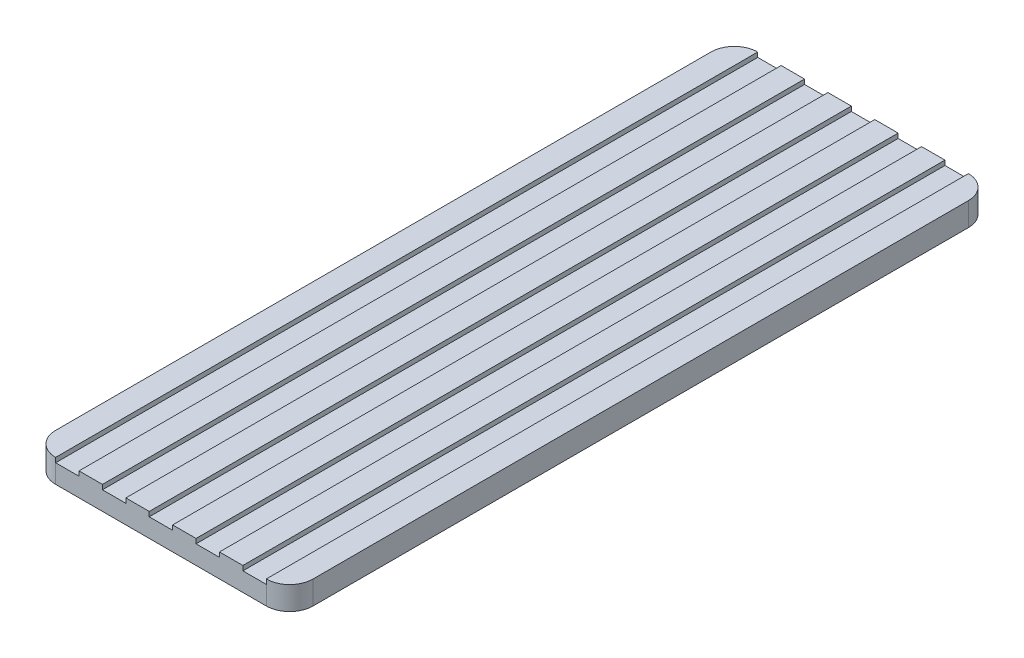
ISO-10303-21;
HEADER;
FILE_DESCRIPTION(('STEP AP214'),'2;1');
FILE_NAME('part.step','',(''),(''),'','','');
FILE_SCHEMA(('AUTOMOTIVE_DESIGN { 1 0 10303 214 1 1 1 1 }'));
ENDSEC;
DATA;
#1=APPLICATION_CONTEXT('core data for automotive mechanical design processes');
#2=APPLICATION_PROTOCOL_DEFINITION('international standard','automotive_design',2000,#1);
#3=PRODUCT_CONTEXT('',#1,'mechanical');
#4=PRODUCT('Part','Part','',(#3));
#5=PRODUCT_RELATED_PRODUCT_CATEGORY('part','',(#4));
#6=PRODUCT_DEFINITION_FORMATION('','',#4);
#7=PRODUCT_DEFINITION_CONTEXT('part definition',#1,'design');
#8=PRODUCT_DEFINITION('design','',#6,#7);
#9=PRODUCT_DEFINITION_SHAPE('','',#8);
#10=(LENGTH_UNIT() NAMED_UNIT(*) SI_UNIT(.MILLI.,.METRE.));
#11=(NAMED_UNIT(*) PLANE_ANGLE_UNIT() SI_UNIT($,.RADIAN.));
#12=(NAMED_UNIT(*) SI_UNIT($,.STERADIAN.) SOLID_ANGLE_UNIT());
#13=UNCERTAINTY_MEASURE_WITH_UNIT(LENGTH_MEASURE(1.E-05),#10,'distance_accuracy_value','');
#14=(GEOMETRIC_REPRESENTATION_CONTEXT(3) GLOBAL_UNCERTAINTY_ASSIGNED_CONTEXT((#13)) GLOBAL_UNIT_ASSIGNED_CONTEXT((#10,
#11,#12)) REPRESENTATION_CONTEXT('',''));
#15=CARTESIAN_POINT('',(0.,0.,0.));
#16=DIRECTION('',(0.,0.,1.));
#17=DIRECTION('',(1.,0.,0.));
#18=AXIS2_PLACEMENT_3D('',#15,#16,#17);
#19=CARTESIAN_POINT('',(0.,5.,0.));
#20=DIRECTION('',(0.,-1.,0.));
#21=DIRECTION('',(0.,0.,-1.));
#22=AXIS2_PLACEMENT_3D('',#19,#20,#21);
#23=PLANE('',#22);
#24=DIRECTION('',(1.,0.,0.));
#25=VECTOR('',#24,1.);
#26=CARTESIAN_POINT('',(-27.5,5.,75.));
#27=LINE('',#26,#25);
#28=CARTESIAN_POINT('',(-17.5,5.,75.));
#29=VERTEX_POINT('',#28);
#30=CARTESIAN_POINT('',(-12.5,5.,75.));
#31=VERTEX_POINT('',#30);
#32=EDGE_CURVE('E354',#29,#31,#27,.T.);
#33=ORIENTED_EDGE('',*,*,#32,.T.);
#34=DIRECTION('',(0.,0.,1.));
#35=VECTOR('',#34,1.);
#36=CARTESIAN_POINT('',(-12.5,5.,-75.));
#37=LINE('',#36,#35);
#38=CARTESIAN_POINT('',(-12.5,5.,-75.));
#39=VERTEX_POINT('',#38);
#40=EDGE_CURVE('E244',#39,#31,#37,.T.);
#41=ORIENTED_EDGE('',*,*,#40,.F.);
#42=DIRECTION('',(-1.,0.,0.));
#43=VECTOR('',#42,1.);
#44=CARTESIAN_POINT('',(-27.5,5.,-75.));
#45=LINE('',#44,#43);
#46=CARTESIAN_POINT('',(-17.5,5.,-75.));
#47=VERTEX_POINT('',#46);
#48=EDGE_CURVE('E234',#39,#47,#45,.T.);
#49=ORIENTED_EDGE('',*,*,#48,.T.);
#50=DIRECTION('',(0.,0.,1.));
#51=VECTOR('',#50,1.);
#52=CARTESIAN_POINT('',(-17.5,5.,-75.));
#53=LINE('',#52,#51);
#54=EDGE_CURVE('E337',#47,#29,#53,.T.);
#55=ORIENTED_EDGE('',*,*,#54,.T.);
#56=EDGE_LOOP('',(#33,#41,#49,#55));
#57=FACE_BOUND('',#56,.T.);
#58=ADVANCED_FACE('F39',(#57),#23,.F.);
#59=CARTESIAN_POINT('',(-2.5,5.,-75.));
#60=VERTEX_POINT('',#59);
#61=CARTESIAN_POINT('',(-7.5,5.,-75.));
#62=VERTEX_POINT('',#61);
#63=EDGE_CURVE('E348',#60,#62,#45,.T.);
#64=ORIENTED_EDGE('',*,*,#63,.T.);
#65=DIRECTION('',(0.,0.,1.));
#66=VECTOR('',#65,1.);
#67=CARTESIAN_POINT('',(-7.5,5.,-75.));
#68=LINE('',#67,#66);
#69=CARTESIAN_POINT('',(-7.5,5.,75.));
#70=VERTEX_POINT('',#69);
#71=EDGE_CURVE('E247',#62,#70,#68,.T.);
#72=ORIENTED_EDGE('',*,*,#71,.T.);
#73=CARTESIAN_POINT('',(-2.5,5.,75.));
#74=VERTEX_POINT('',#73);
#75=EDGE_CURVE('E358',#70,#74,#27,.T.);
#76=ORIENTED_EDGE('',*,*,#75,.T.);
#77=DIRECTION('',(0.,0.,1.));
#78=VECTOR('',#77,1.);
#79=CARTESIAN_POINT('',(-2.5,5.,-75.));
#80=LINE('',#79,#78);
#81=EDGE_CURVE('E242',#60,#74,#80,.T.);
#82=ORIENTED_EDGE('',*,*,#81,.F.);
#83=EDGE_LOOP('',(#64,#72,#76,#82));
#84=FACE_BOUND('',#83,.T.);
#85=ADVANCED_FACE('F471',(#84),#23,.F.);
#86=CARTESIAN_POINT('',(7.5,5.,-75.));
#87=VERTEX_POINT('',#86);
#88=CARTESIAN_POINT('',(2.5,5.,-75.));
#89=VERTEX_POINT('',#88);
#90=EDGE_CURVE('E507',#87,#89,#45,.T.);
#91=ORIENTED_EDGE('',*,*,#90,.T.);
#92=DIRECTION('',(0.,0.,1.));
#93=VECTOR('',#92,1.);
#94=CARTESIAN_POINT('',(2.5,5.,-75.));
#95=LINE('',#94,#93);
#96=CARTESIAN_POINT('',(2.5,5.,75.));
#97=VERTEX_POINT('',#96);
#98=EDGE_CURVE('E270',#89,#97,#95,.T.);
#99=ORIENTED_EDGE('',*,*,#98,.T.);
#100=CARTESIAN_POINT('',(7.5,5.,75.));
#101=VERTEX_POINT('',#100);
#102=EDGE_CURVE('E521',#97,#101,#27,.T.);
#103=ORIENTED_EDGE('',*,*,#102,.T.);
#104=DIRECTION('',(0.,0.,1.));
#105=VECTOR('',#104,1.);
#106=CARTESIAN_POINT('',(7.5,5.,-75.));
#107=LINE('',#106,#105);
#108=EDGE_CURVE('E265',#87,#101,#107,.T.);
#109=ORIENTED_EDGE('',*,*,#108,.F.);
#110=EDGE_LOOP('',(#91,#99,#103,#109));
#111=FACE_BOUND('',#110,.T.);
#112=ADVANCED_FACE('F478',(#111),#23,.F.);
#113=CARTESIAN_POINT('',(17.5,5.,-75.));
#114=VERTEX_POINT('',#113);
#115=CARTESIAN_POINT('',(12.5,5.,-75.));
#116=VERTEX_POINT('',#115);
#117=EDGE_CURVE('E349',#114,#116,#45,.T.);
#118=ORIENTED_EDGE('',*,*,#117,.T.);
#119=DIRECTION('',(0.,0.,1.));
#120=VECTOR('',#119,1.);
#121=CARTESIAN_POINT('',(12.5,5.,-75.));
#122=LINE('',#121,#120);
#123=CARTESIAN_POINT('',(12.5,5.,75.));
#124=VERTEX_POINT('',#123);
#125=EDGE_CURVE('E294',#116,#124,#122,.T.);
#126=ORIENTED_EDGE('',*,*,#125,.T.);
#127=CARTESIAN_POINT('',(17.5,5.,75.));
#128=VERTEX_POINT('',#127);
#129=EDGE_CURVE('E353',#124,#128,#27,.T.);
#130=ORIENTED_EDGE('',*,*,#129,.T.);
#131=DIRECTION('',(0.,0.,1.));
#132=VECTOR('',#131,1.);
#133=CARTESIAN_POINT('',(17.5,5.,-75.));
#134=LINE('',#133,#132);
#135=EDGE_CURVE('E289',#114,#128,#134,.T.);
#136=ORIENTED_EDGE('',*,*,#135,.F.);
#137=EDGE_LOOP('',(#118,#126,#130,#136));
#138=FACE_BOUND('',#137,.T.);
#139=ADVANCED_FACE('F490',(#138),#23,.F.);
#140=CARTESIAN_POINT('',(-22.5,5.,70.));
#141=DIRECTION('',(0.,-1.,0.));
#142=DIRECTION('',(0.,0.,-1.));
#143=AXIS2_PLACEMENT_3D('',#140,#141,#142);
#144=CIRCLE('',#143,5.);
#145=CARTESIAN_POINT('',(-27.5,5.,70.));
#146=VERTEX_POINT('',#145);
#147=CARTESIAN_POINT('',(-22.5,5.,75.));
#148=VERTEX_POINT('',#147);
#149=EDGE_CURVE('E395',#146,#148,#144,.F.);
#150=ORIENTED_EDGE('',*,*,#149,.T.);
#151=DIRECTION('',(0.,0.,1.));
#152=VECTOR('',#151,1.);
#153=CARTESIAN_POINT('',(-22.5,5.,-75.));
#154=LINE('',#153,#152);
#155=CARTESIAN_POINT('',(-22.5,5.,-75.));
#156=VERTEX_POINT('',#155);
#157=EDGE_CURVE('E334',#156,#148,#154,.T.);
#158=ORIENTED_EDGE('',*,*,#157,.F.);
#159=CARTESIAN_POINT('',(-22.5,5.,-70.));
#160=DIRECTION('',(0.,-1.,0.));
#161=DIRECTION('',(0.,0.,-1.));
#162=AXIS2_PLACEMENT_3D('',#159,#160,#161);
#163=CIRCLE('',#162,5.);
#164=CARTESIAN_POINT('',(-27.5,5.,-70.));
#165=VERTEX_POINT('',#164);
#166=EDGE_CURVE('E393',#156,#165,#163,.F.);
#167=ORIENTED_EDGE('',*,*,#166,.T.);
#168=DIRECTION('',(0.,0.,1.));
#169=VECTOR('',#168,1.);
#170=CARTESIAN_POINT('',(-27.5,5.,75.));
#171=LINE('',#170,#169);
#172=EDGE_CURVE('E350',#165,#146,#171,.T.);
#173=ORIENTED_EDGE('',*,*,#172,.T.);
#174=EDGE_LOOP('',(#150,#158,#167,#173));
#175=FACE_BOUND('',#174,.T.);
#176=ADVANCED_FACE('F447',(#175),#23,.F.);
#177=CARTESIAN_POINT('',(27.5,5.,75.));
#178=DIRECTION('',(-1.,0.,0.));
#179=DIRECTION('',(0.,0.,1.));
#180=AXIS2_PLACEMENT_3D('',#177,#178,#179);
#181=PLANE('',#180);
#182=DIRECTION('',(0.,0.,-1.));
#183=VECTOR('',#182,1.);
#184=CARTESIAN_POINT('',(27.5,0.,75.));
#185=LINE('',#184,#183);
#186=CARTESIAN_POINT('',(27.5,0.,70.));
#187=VERTEX_POINT('',#186);
#188=CARTESIAN_POINT('',(27.5,0.,-70.));
#189=VERTEX_POINT('',#188);
#190=EDGE_CURVE('E336',#187,#189,#185,.T.);
#191=ORIENTED_EDGE('',*,*,#190,.T.);
#192=DIRECTION('',(0.,-1.,0.));
#193=VECTOR('',#192,1.);
#194=CARTESIAN_POINT('',(27.5,5.,-70.));
#195=LINE('',#194,#193);
#196=CARTESIAN_POINT('',(27.5,5.,-70.));
#197=VERTEX_POINT('',#196);
#198=EDGE_CURVE('E11',#189,#197,#195,.F.);
#199=ORIENTED_EDGE('',*,*,#198,.T.);
#200=DIRECTION('',(0.,0.,-1.));
#201=VECTOR('',#200,1.);
#202=CARTESIAN_POINT('',(27.5,5.,75.));
#203=LINE('',#202,#201);
#204=CARTESIAN_POINT('',(27.5,5.,70.));
#205=VERTEX_POINT('',#204);
#206=EDGE_CURVE('E343',#205,#197,#203,.T.);
#207=ORIENTED_EDGE('',*,*,#206,.F.);
#208=DIRECTION('',(0.,-1.,0.));
#209=VECTOR('',#208,1.);
#210=CARTESIAN_POINT('',(27.5,5.,70.));
#211=LINE('',#210,#209);
#212=EDGE_CURVE('E47',#205,#187,#211,.T.);
#213=ORIENTED_EDGE('',*,*,#212,.T.);
#214=EDGE_LOOP('',(#191,#199,#207,#213));
#215=FACE_BOUND('',#214,.T.);
#216=ADVANCED_FACE('F409',(#215),#181,.F.);
#217=CARTESIAN_POINT('',(-27.5,5.,-75.));
#218=DIRECTION('',(0.,0.,1.));
#219=DIRECTION('',(1.,0.,0.));
#220=AXIS2_PLACEMENT_3D('',#217,#218,#219);
#221=PLANE('',#220);
#222=ORIENTED_EDGE('',*,*,#48,.F.);
#223=DIRECTION('',(0.,-1.,0.));
#224=VECTOR('',#223,1.);
#225=CARTESIAN_POINT('',(-12.5,5.,-75.));
#226=LINE('',#225,#224);
#227=CARTESIAN_POINT('',(-12.5,4.,-75.));
#228=VERTEX_POINT('',#227);
#229=EDGE_CURVE('E214',#39,#228,#226,.T.);
#230=ORIENTED_EDGE('',*,*,#229,.T.);
#231=DIRECTION('',(1.,0.,0.));
#232=VECTOR('',#231,1.);
#233=CARTESIAN_POINT('',(-12.5,4.,-75.));
#234=LINE('',#233,#232);
#235=CARTESIAN_POINT('',(-7.5,4.,-75.));
#236=VERTEX_POINT('',#235);
#237=EDGE_CURVE('E225',#228,#236,#234,.T.);
#238=ORIENTED_EDGE('',*,*,#237,.T.);
#239=DIRECTION('',(0.,1.,0.));
#240=VECTOR('',#239,1.);
#241=CARTESIAN_POINT('',(-7.5,5.,-75.));
#242=LINE('',#241,#240);
#243=EDGE_CURVE('E222',#236,#62,#242,.T.);
#244=ORIENTED_EDGE('',*,*,#243,.T.);
#245=ORIENTED_EDGE('',*,*,#63,.F.);
#246=DIRECTION('',(0.,-1.,0.));
#247=VECTOR('',#246,1.);
#248=CARTESIAN_POINT('',(-2.5,5.,-75.));
#249=LINE('',#248,#247);
#250=CARTESIAN_POINT('',(-2.5,4.,-75.));
#251=VERTEX_POINT('',#250);
#252=EDGE_CURVE('E251',#60,#251,#249,.T.);
#253=ORIENTED_EDGE('',*,*,#252,.T.);
#254=DIRECTION('',(1.,0.,0.));
#255=VECTOR('',#254,1.);
#256=CARTESIAN_POINT('',(-2.5,4.,-75.));
#257=LINE('',#256,#255);
#258=CARTESIAN_POINT('',(2.5,4.,-75.));
#259=VERTEX_POINT('',#258);
#260=EDGE_CURVE('E254',#251,#259,#257,.T.);
#261=ORIENTED_EDGE('',*,*,#260,.T.);
#262=DIRECTION('',(0.,1.,0.));
#263=VECTOR('',#262,1.);
#264=CARTESIAN_POINT('',(2.5,5.,-75.));
#265=LINE('',#264,#263);
#266=EDGE_CURVE('E257',#259,#89,#265,.T.);
#267=ORIENTED_EDGE('',*,*,#266,.T.);
#268=ORIENTED_EDGE('',*,*,#90,.F.);
#269=DIRECTION('',(0.,-1.,0.));
#270=VECTOR('',#269,1.);
#271=CARTESIAN_POINT('',(7.5,5.,-75.));
#272=LINE('',#271,#270);
#273=CARTESIAN_POINT('',(7.5,4.,-75.));
#274=VERTEX_POINT('',#273);
#275=EDGE_CURVE('E275',#87,#274,#272,.T.);
#276=ORIENTED_EDGE('',*,*,#275,.T.);
#277=DIRECTION('',(1.,0.,0.));
#278=VECTOR('',#277,1.);
#279=CARTESIAN_POINT('',(7.5,4.,-75.));
#280=LINE('',#279,#278);
#281=CARTESIAN_POINT('',(12.5,4.,-75.));
#282=VERTEX_POINT('',#281);
#283=EDGE_CURVE('E278',#274,#282,#280,.T.);
#284=ORIENTED_EDGE('',*,*,#283,.T.);
#285=DIRECTION('',(0.,1.,0.));
#286=VECTOR('',#285,1.);
#287=CARTESIAN_POINT('',(12.5,5.,-75.));
#288=LINE('',#287,#286);
#289=EDGE_CURVE('E281',#282,#116,#288,.T.);
#290=ORIENTED_EDGE('',*,*,#289,.T.);
#291=ORIENTED_EDGE('',*,*,#117,.F.);
#292=DIRECTION('',(0.,-1.,0.));
#293=VECTOR('',#292,1.);
#294=CARTESIAN_POINT('',(17.5,5.,-75.));
#295=LINE('',#294,#293);
#296=CARTESIAN_POINT('',(17.5,4.,-75.));
#297=VERTEX_POINT('',#296);
#298=EDGE_CURVE('E299',#114,#297,#295,.T.);
#299=ORIENTED_EDGE('',*,*,#298,.T.);
#300=DIRECTION('',(1.,0.,0.));
#301=VECTOR('',#300,1.);
#302=CARTESIAN_POINT('',(17.5,4.,-75.));
#303=LINE('',#302,#301);
#304=CARTESIAN_POINT('',(22.5,4.,-75.));
#305=VERTEX_POINT('',#304);
#306=EDGE_CURVE('E302',#297,#305,#303,.T.);
#307=ORIENTED_EDGE('',*,*,#306,.T.);
#308=DIRECTION('',(0.,-1.,0.));
#309=VECTOR('',#308,1.);
#310=CARTESIAN_POINT('',(22.5,5.,-75.));
#311=LINE('',#310,#309);
#312=CARTESIAN_POINT('',(22.5,0.,-75.));
#313=VERTEX_POINT('',#312);
#314=EDGE_CURVE('E398',#305,#313,#311,.T.);
#315=ORIENTED_EDGE('',*,*,#314,.T.);
#316=DIRECTION('',(-1.,0.,0.));
#317=VECTOR('',#316,1.);
#318=CARTESIAN_POINT('',(-27.5,0.,-75.));
#319=LINE('',#318,#317);
#320=CARTESIAN_POINT('',(-22.5,0.,-75.));
#321=VERTEX_POINT('',#320);
#322=EDGE_CURVE('E361',#313,#321,#319,.T.);
#323=ORIENTED_EDGE('',*,*,#322,.T.);
#324=DIRECTION('',(0.,-1.,0.));
#325=VECTOR('',#324,1.);
#326=CARTESIAN_POINT('',(-22.5,5.,-75.));
#327=LINE('',#326,#325);
#328=CARTESIAN_POINT('',(-22.5,4.,-75.));
#329=VERTEX_POINT('',#328);
#330=EDGE_CURVE('E402',#321,#329,#327,.F.);
#331=ORIENTED_EDGE('',*,*,#330,.T.);
#332=DIRECTION('',(1.,0.,0.));
#333=VECTOR('',#332,1.);
#334=CARTESIAN_POINT('',(-22.5,4.,-75.));
#335=LINE('',#334,#333);
#336=CARTESIAN_POINT('',(-17.5,4.,-75.));
#337=VERTEX_POINT('',#336);
#338=EDGE_CURVE('E324',#329,#337,#335,.T.);
#339=ORIENTED_EDGE('',*,*,#338,.T.);
#340=DIRECTION('',(0.,1.,0.));
#341=VECTOR('',#340,1.);
#342=CARTESIAN_POINT('',(-17.5,5.,-75.));
#343=LINE('',#342,#341);
#344=EDGE_CURVE('E328',#337,#47,#343,.T.);
#345=ORIENTED_EDGE('',*,*,#344,.T.);
#346=EDGE_LOOP('',(#222,#230,#238,#244,#245,#253,#261,#267,#268,#276,#284,#290,#291,#299,#307,
#315,#323,#331,#339,#345));
#347=FACE_BOUND('',#346,.T.);
#348=ADVANCED_FACE('F232',(#347),#221,.F.);
#349=CARTESIAN_POINT('',(-27.5,5.,75.));
#350=DIRECTION('',(1.,0.,0.));
#351=DIRECTION('',(0.,0.,-1.));
#352=AXIS2_PLACEMENT_3D('',#349,#350,#351);
#353=PLANE('',#352);
#354=DIRECTION('',(0.,0.,1.));
#355=VECTOR('',#354,1.);
#356=CARTESIAN_POINT('',(-27.5,0.,75.));
#357=LINE('',#356,#355);
#358=CARTESIAN_POINT('',(-27.5,0.,-70.));
#359=VERTEX_POINT('',#358);
#360=CARTESIAN_POINT('',(-27.5,0.,70.));
#361=VERTEX_POINT('',#360);
#362=EDGE_CURVE('E364',#359,#361,#357,.T.);
#363=ORIENTED_EDGE('',*,*,#362,.T.);
#364=DIRECTION('',(0.,-1.,0.));
#365=VECTOR('',#364,1.);
#366=CARTESIAN_POINT('',(-27.5,5.,70.));
#367=LINE('',#366,#365);
#368=EDGE_CURVE('E386',#361,#146,#367,.F.);
#369=ORIENTED_EDGE('',*,*,#368,.T.);
#370=ORIENTED_EDGE('',*,*,#172,.F.);
#371=DIRECTION('',(0.,-1.,0.));
#372=VECTOR('',#371,1.);
#373=CARTESIAN_POINT('',(-27.5,5.,-70.));
#374=LINE('',#373,#372);
#375=EDGE_CURVE('E383',#165,#359,#374,.T.);
#376=ORIENTED_EDGE('',*,*,#375,.T.);
#377=EDGE_LOOP('',(#363,#369,#370,#376));
#378=FACE_BOUND('',#377,.T.);
#379=ADVANCED_FACE('F439',(#378),#353,.F.);
#380=CARTESIAN_POINT('',(-27.5,5.,75.));
#381=DIRECTION('',(0.,0.,-1.));
#382=DIRECTION('',(-1.,0.,0.));
#383=AXIS2_PLACEMENT_3D('',#380,#381,#382);
#384=PLANE('',#383);
#385=DIRECTION('',(1.,0.,0.));
#386=VECTOR('',#385,1.);
#387=CARTESIAN_POINT('',(-12.5,4.,75.));
#388=LINE('',#387,#386);
#389=CARTESIAN_POINT('',(-12.5,4.,75.));
#390=VERTEX_POINT('',#389);
#391=CARTESIAN_POINT('',(-7.5,4.,75.));
#392=VERTEX_POINT('',#391);
#393=EDGE_CURVE('E237',#390,#392,#388,.T.);
#394=ORIENTED_EDGE('',*,*,#393,.F.);
#395=DIRECTION('',(0.,-1.,0.));
#396=VECTOR('',#395,1.);
#397=CARTESIAN_POINT('',(-12.5,5.,75.));
#398=LINE('',#397,#396);
#399=EDGE_CURVE('E217',#31,#390,#398,.T.);
#400=ORIENTED_EDGE('',*,*,#399,.F.);
#401=ORIENTED_EDGE('',*,*,#32,.F.);
#402=DIRECTION('',(0.,1.,0.));
#403=VECTOR('',#402,1.);
#404=CARTESIAN_POINT('',(-17.5,5.,75.));
#405=LINE('',#404,#403);
#406=CARTESIAN_POINT('',(-17.5,4.,75.));
#407=VERTEX_POINT('',#406);
#408=EDGE_CURVE('E325',#407,#29,#405,.T.);
#409=ORIENTED_EDGE('',*,*,#408,.F.);
#410=DIRECTION('',(1.,0.,0.));
#411=VECTOR('',#410,1.);
#412=CARTESIAN_POINT('',(-22.5,4.,75.));
#413=LINE('',#412,#411);
#414=CARTESIAN_POINT('',(-22.5,4.,75.));
#415=VERTEX_POINT('',#414);
#416=EDGE_CURVE('E246',#415,#407,#413,.T.);
#417=ORIENTED_EDGE('',*,*,#416,.F.);
#418=DIRECTION('',(0.,-1.,0.));
#419=VECTOR('',#418,1.);
#420=CARTESIAN_POINT('',(-22.5,5.,75.));
#421=LINE('',#420,#419);
#422=CARTESIAN_POINT('',(-22.5,0.,75.));
#423=VERTEX_POINT('',#422);
#424=EDGE_CURVE('E371',#415,#423,#421,.T.);
#425=ORIENTED_EDGE('',*,*,#424,.T.);
#426=DIRECTION('',(1.,0.,0.));
#427=VECTOR('',#426,1.);
#428=CARTESIAN_POINT('',(-27.5,0.,75.));
#429=LINE('',#428,#427);
#430=CARTESIAN_POINT('',(22.5,0.,75.));
#431=VERTEX_POINT('',#430);
#432=EDGE_CURVE('E346',#423,#431,#429,.T.);
#433=ORIENTED_EDGE('',*,*,#432,.T.);
#434=DIRECTION('',(0.,-1.,0.));
#435=VECTOR('',#434,1.);
#436=CARTESIAN_POINT('',(22.5,5.,75.));
#437=LINE('',#436,#435);
#438=CARTESIAN_POINT('',(22.5,4.,75.));
#439=VERTEX_POINT('',#438);
#440=EDGE_CURVE('E357',#431,#439,#437,.F.);
#441=ORIENTED_EDGE('',*,*,#440,.T.);
#442=DIRECTION('',(1.,0.,0.));
#443=VECTOR('',#442,1.);
#444=CARTESIAN_POINT('',(17.5,4.,75.));
#445=LINE('',#444,#443);
#446=CARTESIAN_POINT('',(17.5,4.,75.));
#447=VERTEX_POINT('',#446);
#448=EDGE_CURVE('E310',#447,#439,#445,.T.);
#449=ORIENTED_EDGE('',*,*,#448,.F.);
#450=DIRECTION('',(0.,-1.,0.));
#451=VECTOR('',#450,1.);
#452=CARTESIAN_POINT('',(17.5,5.,75.));
#453=LINE('',#452,#451);
#454=EDGE_CURVE('E307',#128,#447,#453,.T.);
#455=ORIENTED_EDGE('',*,*,#454,.F.);
#456=ORIENTED_EDGE('',*,*,#129,.F.);
#457=DIRECTION('',(0.,1.,0.));
#458=VECTOR('',#457,1.);
#459=CARTESIAN_POINT('',(12.5,5.,75.));
#460=LINE('',#459,#458);
#461=CARTESIAN_POINT('',(12.5,4.,75.));
#462=VERTEX_POINT('',#461);
#463=EDGE_CURVE('E54',#462,#124,#460,.T.);
#464=ORIENTED_EDGE('',*,*,#463,.F.);
#465=DIRECTION('',(1.,0.,0.));
#466=VECTOR('',#465,1.);
#467=CARTESIAN_POINT('',(7.5,4.,75.));
#468=LINE('',#467,#466);
#469=CARTESIAN_POINT('',(7.5,4.,75.));
#470=VERTEX_POINT('',#469);
#471=EDGE_CURVE('E288',#470,#462,#468,.T.);
#472=ORIENTED_EDGE('',*,*,#471,.F.);
#473=DIRECTION('',(0.,-1.,0.));
#474=VECTOR('',#473,1.);
#475=CARTESIAN_POINT('',(7.5,5.,75.));
#476=LINE('',#475,#474);
#477=EDGE_CURVE('E285',#101,#470,#476,.T.);
#478=ORIENTED_EDGE('',*,*,#477,.F.);
#479=ORIENTED_EDGE('',*,*,#102,.F.);
#480=DIRECTION('',(0.,1.,0.));
#481=VECTOR('',#480,1.);
#482=CARTESIAN_POINT('',(2.5,5.,75.));
#483=LINE('',#482,#481);
#484=CARTESIAN_POINT('',(2.5,4.,75.));
#485=VERTEX_POINT('',#484);
#486=EDGE_CURVE('E62',#485,#97,#483,.T.);
#487=ORIENTED_EDGE('',*,*,#486,.F.);
#488=DIRECTION('',(1.,0.,0.));
#489=VECTOR('',#488,1.);
#490=CARTESIAN_POINT('',(-2.5,4.,75.));
#491=LINE('',#490,#489);
#492=CARTESIAN_POINT('',(-2.5,4.,75.));
#493=VERTEX_POINT('',#492);
#494=EDGE_CURVE('E264',#493,#485,#491,.T.);
#495=ORIENTED_EDGE('',*,*,#494,.F.);
#496=DIRECTION('',(0.,-1.,0.));
#497=VECTOR('',#496,1.);
#498=CARTESIAN_POINT('',(-2.5,5.,75.));
#499=LINE('',#498,#497);
#500=EDGE_CURVE('E261',#74,#493,#499,.T.);
#501=ORIENTED_EDGE('',*,*,#500,.F.);
#502=ORIENTED_EDGE('',*,*,#75,.F.);
#503=DIRECTION('',(0.,1.,0.));
#504=VECTOR('',#503,1.);
#505=CARTESIAN_POINT('',(-7.5,5.,75.));
#506=LINE('',#505,#504);
#507=EDGE_CURVE('E235',#392,#70,#506,.T.);
#508=ORIENTED_EDGE('',*,*,#507,.F.);
#509=EDGE_LOOP('',(#394,#400,#401,#409,#417,#425,#433,#441,#449,#455,#456,#464,#472,#478,#479,
#487,#495,#501,#502,#508));
#510=FACE_BOUND('',#509,.T.);
#511=ADVANCED_FACE('F430',(#510),#384,.F.);
#512=CARTESIAN_POINT('',(22.5,5.,-70.));
#513=DIRECTION('',(0.,-1.,0.));
#514=DIRECTION('',(0.,0.,-1.));
#515=AXIS2_PLACEMENT_3D('',#512,#513,#514);
#516=CIRCLE('',#515,5.);
#517=CARTESIAN_POINT('',(22.5,5.,-75.));
#518=VERTEX_POINT('',#517);
#519=EDGE_CURVE('E390',#197,#518,#516,.F.);
#520=ORIENTED_EDGE('',*,*,#519,.T.);
#521=DIRECTION('',(0.,0.,1.));
#522=VECTOR('',#521,1.);
#523=CARTESIAN_POINT('',(22.5,5.,-75.));
#524=LINE('',#523,#522);
#525=CARTESIAN_POINT('',(22.5,5.,75.));
#526=VERTEX_POINT('',#525);
#527=EDGE_CURVE('E314',#518,#526,#524,.T.);
#528=ORIENTED_EDGE('',*,*,#527,.T.);
#529=CARTESIAN_POINT('',(22.5,5.,70.));
#530=DIRECTION('',(0.,-1.,0.));
#531=DIRECTION('',(0.,0.,-1.));
#532=AXIS2_PLACEMENT_3D('',#529,#530,#531);
#533=CIRCLE('',#532,5.);
#534=EDGE_CURVE('E388',#526,#205,#533,.F.);
#535=ORIENTED_EDGE('',*,*,#534,.T.);
#536=ORIENTED_EDGE('',*,*,#206,.T.);
#537=EDGE_LOOP('',(#520,#528,#535,#536));
#538=FACE_BOUND('',#537,.T.);
#539=ADVANCED_FACE('F424',(#538),#23,.F.);
#540=CARTESIAN_POINT('',(0.,0.,0.));
#541=DIRECTION('',(0.,-1.,0.));
#542=DIRECTION('',(0.,0.,-1.));
#543=AXIS2_PLACEMENT_3D('',#540,#541,#542);
#544=PLANE('',#543);
#545=ORIENTED_EDGE('',*,*,#432,.F.);
#546=CARTESIAN_POINT('',(-22.5,0.,70.));
#547=DIRECTION('',(0.,-1.,0.));
#548=DIRECTION('',(0.,0.,-1.));
#549=AXIS2_PLACEMENT_3D('',#546,#547,#548);
#550=CIRCLE('',#549,5.);
#551=EDGE_CURVE('E381',#423,#361,#550,.T.);
#552=ORIENTED_EDGE('',*,*,#551,.T.);
#553=ORIENTED_EDGE('',*,*,#362,.F.);
#554=CARTESIAN_POINT('',(-22.5,0.,-70.));
#555=DIRECTION('',(0.,-1.,0.));
#556=DIRECTION('',(0.,0.,-1.));
#557=AXIS2_PLACEMENT_3D('',#554,#555,#556);
#558=CIRCLE('',#557,5.);
#559=EDGE_CURVE('E379',#359,#321,#558,.T.);
#560=ORIENTED_EDGE('',*,*,#559,.T.);
#561=ORIENTED_EDGE('',*,*,#322,.F.);
#562=CARTESIAN_POINT('',(22.5,0.,-70.));
#563=DIRECTION('',(0.,-1.,0.));
#564=DIRECTION('',(0.,0.,-1.));
#565=AXIS2_PLACEMENT_3D('',#562,#563,#564);
#566=CIRCLE('',#565,5.);
#567=EDGE_CURVE('E377',#313,#189,#566,.T.);
#568=ORIENTED_EDGE('',*,*,#567,.T.);
#569=ORIENTED_EDGE('',*,*,#190,.F.);
#570=CARTESIAN_POINT('',(22.5,0.,70.));
#571=DIRECTION('',(0.,-1.,0.));
#572=DIRECTION('',(0.,0.,-1.));
#573=AXIS2_PLACEMENT_3D('',#570,#571,#572);
#574=CIRCLE('',#573,5.);
#575=EDGE_CURVE('E375',#187,#431,#574,.T.);
#576=ORIENTED_EDGE('',*,*,#575,.T.);
#577=EDGE_LOOP('',(#545,#552,#553,#560,#561,#568,#569,#576));
#578=FACE_BOUND('',#577,.T.);
#579=ADVANCED_FACE('F415',(#578),#544,.T.);
#580=CARTESIAN_POINT('',(-22.5,5.,70.));
#581=DIRECTION('',(0.,-1.,0.));
#582=DIRECTION('',(0.,0.,-1.));
#583=AXIS2_PLACEMENT_3D('',#580,#581,#582);
#584=CYLINDRICAL_SURFACE('',#583,5.);
#585=ORIENTED_EDGE('',*,*,#149,.F.);
#586=ORIENTED_EDGE('',*,*,#368,.F.);
#587=ORIENTED_EDGE('',*,*,#551,.F.);
#588=ORIENTED_EDGE('',*,*,#424,.F.);
#589=EDGE_CURVE('E372',#148,#415,#421,.T.);
#590=ORIENTED_EDGE('',*,*,#589,.F.);
#591=EDGE_LOOP('',(#585,#586,#587,#588,#590));
#592=FACE_BOUND('',#591,.T.);
#593=ADVANCED_FACE('F443',(#592),#584,.T.);
#594=CARTESIAN_POINT('',(-22.5,5.,-70.));
#595=DIRECTION('',(0.,-1.,0.));
#596=DIRECTION('',(0.,0.,-1.));
#597=AXIS2_PLACEMENT_3D('',#594,#595,#596);
#598=CYLINDRICAL_SURFACE('',#597,5.);
#599=ORIENTED_EDGE('',*,*,#166,.F.);
#600=DIRECTION('',(0.,-1.,0.));
#601=VECTOR('',#600,1.);
#602=CARTESIAN_POINT('',(-22.5,5.,-75.));
#603=LINE('',#602,#601);
#604=EDGE_CURVE('E321',#156,#329,#603,.T.);
#605=ORIENTED_EDGE('',*,*,#604,.T.);
#606=ORIENTED_EDGE('',*,*,#330,.F.);
#607=ORIENTED_EDGE('',*,*,#559,.F.);
#608=ORIENTED_EDGE('',*,*,#375,.F.);
#609=EDGE_LOOP('',(#599,#605,#606,#607,#608));
#610=FACE_BOUND('',#609,.T.);
#611=ADVANCED_FACE('F450',(#610),#598,.T.);
#612=CARTESIAN_POINT('',(22.5,5.,-70.));
#613=DIRECTION('',(0.,-1.,0.));
#614=DIRECTION('',(0.,0.,-1.));
#615=AXIS2_PLACEMENT_3D('',#612,#613,#614);
#616=CYLINDRICAL_SURFACE('',#615,5.);
#617=ORIENTED_EDGE('',*,*,#519,.F.);
#618=ORIENTED_EDGE('',*,*,#198,.F.);
#619=ORIENTED_EDGE('',*,*,#567,.F.);
#620=ORIENTED_EDGE('',*,*,#314,.F.);
#621=EDGE_CURVE('E399',#518,#305,#311,.T.);
#622=ORIENTED_EDGE('',*,*,#621,.F.);
#623=EDGE_LOOP('',(#617,#618,#619,#620,#622));
#624=FACE_BOUND('',#623,.T.);
#625=ADVANCED_FACE('F421',(#624),#616,.T.);
#626=CARTESIAN_POINT('',(22.5,5.,70.));
#627=DIRECTION('',(0.,-1.,0.));
#628=DIRECTION('',(0.,0.,-1.));
#629=AXIS2_PLACEMENT_3D('',#626,#627,#628);
#630=CYLINDRICAL_SURFACE('',#629,5.);
#631=ORIENTED_EDGE('',*,*,#534,.F.);
#632=DIRECTION('',(0.,1.,0.));
#633=VECTOR('',#632,1.);
#634=CARTESIAN_POINT('',(22.5,5.,75.));
#635=LINE('',#634,#633);
#636=EDGE_CURVE('E303',#439,#526,#635,.T.);
#637=ORIENTED_EDGE('',*,*,#636,.F.);
#638=ORIENTED_EDGE('',*,*,#440,.F.);
#639=ORIENTED_EDGE('',*,*,#575,.F.);
#640=ORIENTED_EDGE('',*,*,#212,.F.);
#641=EDGE_LOOP('',(#631,#637,#638,#639,#640));
#642=FACE_BOUND('',#641,.T.);
#643=ADVANCED_FACE('F41',(#642),#630,.T.);
#644=CARTESIAN_POINT('',(-22.5,5.,-75.));
#645=DIRECTION('',(-1.,0.,0.));
#646=DIRECTION('',(0.,0.,1.));
#647=AXIS2_PLACEMENT_3D('',#644,#645,#646);
#648=PLANE('',#647);
#649=ORIENTED_EDGE('',*,*,#589,.T.);
#650=DIRECTION('',(0.,0.,1.));
#651=VECTOR('',#650,1.);
#652=CARTESIAN_POINT('',(-22.5,4.,-75.));
#653=LINE('',#652,#651);
#654=EDGE_CURVE('E330',#329,#415,#653,.T.);
#655=ORIENTED_EDGE('',*,*,#654,.F.);
#656=ORIENTED_EDGE('',*,*,#604,.F.);
#657=ORIENTED_EDGE('',*,*,#157,.T.);
#658=EDGE_LOOP('',(#649,#655,#656,#657));
#659=FACE_BOUND('',#658,.T.);
#660=ADVANCED_FACE('F644',(#659),#648,.F.);
#661=CARTESIAN_POINT('',(-17.5,5.,-75.));
#662=DIRECTION('',(1.,0.,0.));
#663=DIRECTION('',(0.,0.,-1.));
#664=AXIS2_PLACEMENT_3D('',#661,#662,#663);
#665=PLANE('',#664);
#666=ORIENTED_EDGE('',*,*,#408,.T.);
#667=ORIENTED_EDGE('',*,*,#54,.F.);
#668=ORIENTED_EDGE('',*,*,#344,.F.);
#669=DIRECTION('',(0.,0.,1.));
#670=VECTOR('',#669,1.);
#671=CARTESIAN_POINT('',(-17.5,4.,-75.));
#672=LINE('',#671,#670);
#673=EDGE_CURVE('E340',#337,#407,#672,.T.);
#674=ORIENTED_EDGE('',*,*,#673,.T.);
#675=EDGE_LOOP('',(#666,#667,#668,#674));
#676=FACE_BOUND('',#675,.T.);
#677=ADVANCED_FACE('F635',(#676),#665,.F.);
#678=CARTESIAN_POINT('',(-22.5,4.,-75.));
#679=DIRECTION('',(0.,-1.,0.));
#680=DIRECTION('',(0.,0.,-1.));
#681=AXIS2_PLACEMENT_3D('',#678,#679,#680);
#682=PLANE('',#681);
#683=ORIENTED_EDGE('',*,*,#416,.T.);
#684=ORIENTED_EDGE('',*,*,#673,.F.);
#685=ORIENTED_EDGE('',*,*,#338,.F.);
#686=ORIENTED_EDGE('',*,*,#654,.T.);
#687=EDGE_LOOP('',(#683,#684,#685,#686));
#688=FACE_BOUND('',#687,.T.);
#689=ADVANCED_FACE('F466',(#688),#682,.F.);
#690=CARTESIAN_POINT('',(17.5,5.,-75.));
#691=DIRECTION('',(-1.,0.,0.));
#692=DIRECTION('',(0.,0.,1.));
#693=AXIS2_PLACEMENT_3D('',#690,#691,#692);
#694=PLANE('',#693);
#695=ORIENTED_EDGE('',*,*,#454,.T.);
#696=DIRECTION('',(0.,0.,1.));
#697=VECTOR('',#696,1.);
#698=CARTESIAN_POINT('',(17.5,4.,-75.));
#699=LINE('',#698,#697);
#700=EDGE_CURVE('E306',#297,#447,#699,.T.);
#701=ORIENTED_EDGE('',*,*,#700,.F.);
#702=ORIENTED_EDGE('',*,*,#298,.F.);
#703=ORIENTED_EDGE('',*,*,#135,.T.);
#704=EDGE_LOOP('',(#695,#701,#702,#703));
#705=FACE_BOUND('',#704,.T.);
#706=ADVANCED_FACE('F458',(#705),#694,.F.);
#707=CARTESIAN_POINT('',(22.5,5.,-75.));
#708=DIRECTION('',(1.,0.,0.));
#709=DIRECTION('',(0.,0.,-1.));
#710=AXIS2_PLACEMENT_3D('',#707,#708,#709);
#711=PLANE('',#710);
#712=ORIENTED_EDGE('',*,*,#636,.T.);
#713=ORIENTED_EDGE('',*,*,#527,.F.);
#714=ORIENTED_EDGE('',*,*,#621,.T.);
#715=DIRECTION('',(0.,0.,1.));
#716=VECTOR('',#715,1.);
#717=CARTESIAN_POINT('',(22.5,4.,-75.));
#718=LINE('',#717,#716);
#719=EDGE_CURVE('E317',#305,#439,#718,.T.);
#720=ORIENTED_EDGE('',*,*,#719,.T.);
#721=EDGE_LOOP('',(#712,#713,#714,#720));
#722=FACE_BOUND('',#721,.T.);
#723=ADVANCED_FACE('F456',(#722),#711,.F.);
#724=CARTESIAN_POINT('',(17.5,4.,-75.));
#725=DIRECTION('',(0.,-1.,0.));
#726=DIRECTION('',(0.,0.,-1.));
#727=AXIS2_PLACEMENT_3D('',#724,#725,#726);
#728=PLANE('',#727);
#729=ORIENTED_EDGE('',*,*,#448,.T.);
#730=ORIENTED_EDGE('',*,*,#719,.F.);
#731=ORIENTED_EDGE('',*,*,#306,.F.);
#732=ORIENTED_EDGE('',*,*,#700,.T.);
#733=EDGE_LOOP('',(#729,#730,#731,#732));
#734=FACE_BOUND('',#733,.T.);
#735=ADVANCED_FACE('F455',(#734),#728,.F.);
#736=CARTESIAN_POINT('',(7.5,5.,-75.));
#737=DIRECTION('',(-1.,0.,0.));
#738=DIRECTION('',(0.,0.,1.));
#739=AXIS2_PLACEMENT_3D('',#736,#737,#738);
#740=PLANE('',#739);
#741=ORIENTED_EDGE('',*,*,#477,.T.);
#742=DIRECTION('',(0.,0.,1.));
#743=VECTOR('',#742,1.);
#744=CARTESIAN_POINT('',(7.5,4.,-75.));
#745=LINE('',#744,#743);
#746=EDGE_CURVE('E284',#274,#470,#745,.T.);
#747=ORIENTED_EDGE('',*,*,#746,.F.);
#748=ORIENTED_EDGE('',*,*,#275,.F.);
#749=ORIENTED_EDGE('',*,*,#108,.T.);
#750=EDGE_LOOP('',(#741,#747,#748,#749));
#751=FACE_BOUND('',#750,.T.);
#752=ADVANCED_FACE('F464',(#751),#740,.F.);
#753=CARTESIAN_POINT('',(12.5,5.,-75.));
#754=DIRECTION('',(1.,0.,0.));
#755=DIRECTION('',(0.,0.,-1.));
#756=AXIS2_PLACEMENT_3D('',#753,#754,#755);
#757=PLANE('',#756);
#758=ORIENTED_EDGE('',*,*,#463,.T.);
#759=ORIENTED_EDGE('',*,*,#125,.F.);
#760=ORIENTED_EDGE('',*,*,#289,.F.);
#761=DIRECTION('',(0.,0.,1.));
#762=VECTOR('',#761,1.);
#763=CARTESIAN_POINT('',(12.5,4.,-75.));
#764=LINE('',#763,#762);
#765=EDGE_CURVE('E296',#282,#462,#764,.T.);
#766=ORIENTED_EDGE('',*,*,#765,.T.);
#767=EDGE_LOOP('',(#758,#759,#760,#766));
#768=FACE_BOUND('',#767,.T.);
#769=ADVANCED_FACE('F545',(#768),#757,.F.);
#770=CARTESIAN_POINT('',(7.5,4.,-75.));
#771=DIRECTION('',(0.,-1.,0.));
#772=DIRECTION('',(0.,0.,-1.));
#773=AXIS2_PLACEMENT_3D('',#770,#771,#772);
#774=PLANE('',#773);
#775=ORIENTED_EDGE('',*,*,#471,.T.);
#776=ORIENTED_EDGE('',*,*,#765,.F.);
#777=ORIENTED_EDGE('',*,*,#283,.F.);
#778=ORIENTED_EDGE('',*,*,#746,.T.);
#779=EDGE_LOOP('',(#775,#776,#777,#778));
#780=FACE_BOUND('',#779,.T.);
#781=ADVANCED_FACE('F527',(#780),#774,.F.);
#782=CARTESIAN_POINT('',(-2.5,5.,-75.));
#783=DIRECTION('',(-1.,0.,0.));
#784=DIRECTION('',(0.,0.,1.));
#785=AXIS2_PLACEMENT_3D('',#782,#783,#784);
#786=PLANE('',#785);
#787=ORIENTED_EDGE('',*,*,#500,.T.);
#788=DIRECTION('',(0.,0.,1.));
#789=VECTOR('',#788,1.);
#790=CARTESIAN_POINT('',(-2.5,4.,-75.));
#791=LINE('',#790,#789);
#792=EDGE_CURVE('E260',#251,#493,#791,.T.);
#793=ORIENTED_EDGE('',*,*,#792,.F.);
#794=ORIENTED_EDGE('',*,*,#252,.F.);
#795=ORIENTED_EDGE('',*,*,#81,.T.);
#796=EDGE_LOOP('',(#787,#793,#794,#795));
#797=FACE_BOUND('',#796,.T.);
#798=ADVANCED_FACE('F537',(#797),#786,.F.);
#799=CARTESIAN_POINT('',(2.5,5.,-75.));
#800=DIRECTION('',(1.,0.,0.));
#801=DIRECTION('',(0.,0.,-1.));
#802=AXIS2_PLACEMENT_3D('',#799,#800,#801);
#803=PLANE('',#802);
#804=ORIENTED_EDGE('',*,*,#486,.T.);
#805=ORIENTED_EDGE('',*,*,#98,.F.);
#806=ORIENTED_EDGE('',*,*,#266,.F.);
#807=DIRECTION('',(0.,0.,1.));
#808=VECTOR('',#807,1.);
#809=CARTESIAN_POINT('',(2.5,4.,-75.));
#810=LINE('',#809,#808);
#811=EDGE_CURVE('E272',#259,#485,#810,.T.);
#812=ORIENTED_EDGE('',*,*,#811,.T.);
#813=EDGE_LOOP('',(#804,#805,#806,#812));
#814=FACE_BOUND('',#813,.T.);
#815=ADVANCED_FACE('F533',(#814),#803,.F.);
#816=CARTESIAN_POINT('',(-2.5,4.,-75.));
#817=DIRECTION('',(0.,-1.,0.));
#818=DIRECTION('',(0.,0.,-1.));
#819=AXIS2_PLACEMENT_3D('',#816,#817,#818);
#820=PLANE('',#819);
#821=ORIENTED_EDGE('',*,*,#494,.T.);
#822=ORIENTED_EDGE('',*,*,#811,.F.);
#823=ORIENTED_EDGE('',*,*,#260,.F.);
#824=ORIENTED_EDGE('',*,*,#792,.T.);
#825=EDGE_LOOP('',(#821,#822,#823,#824));
#826=FACE_BOUND('',#825,.T.);
#827=ADVANCED_FACE('F535',(#826),#820,.F.);
#828=CARTESIAN_POINT('',(-12.5,5.,-75.));
#829=DIRECTION('',(-1.,0.,0.));
#830=DIRECTION('',(0.,0.,1.));
#831=AXIS2_PLACEMENT_3D('',#828,#829,#830);
#832=PLANE('',#831);
#833=ORIENTED_EDGE('',*,*,#399,.T.);
#834=DIRECTION('',(0.,0.,1.));
#835=VECTOR('',#834,1.);
#836=CARTESIAN_POINT('',(-12.5,4.,-75.));
#837=LINE('',#836,#835);
#838=EDGE_CURVE('E210',#228,#390,#837,.T.);
#839=ORIENTED_EDGE('',*,*,#838,.F.);
#840=ORIENTED_EDGE('',*,*,#229,.F.);
#841=ORIENTED_EDGE('',*,*,#40,.T.);
#842=EDGE_LOOP('',(#833,#839,#840,#841));
#843=FACE_BOUND('',#842,.T.);
#844=ADVANCED_FACE('F212',(#843),#832,.F.);
#845=CARTESIAN_POINT('',(-7.5,5.,-75.));
#846=DIRECTION('',(1.,0.,0.));
#847=DIRECTION('',(0.,0.,-1.));
#848=AXIS2_PLACEMENT_3D('',#845,#846,#847);
#849=PLANE('',#848);
#850=ORIENTED_EDGE('',*,*,#507,.T.);
#851=ORIENTED_EDGE('',*,*,#71,.F.);
#852=ORIENTED_EDGE('',*,*,#243,.F.);
#853=DIRECTION('',(0.,0.,1.));
#854=VECTOR('',#853,1.);
#855=CARTESIAN_POINT('',(-7.5,4.,-75.));
#856=LINE('',#855,#854);
#857=EDGE_CURVE('E221',#236,#392,#856,.T.);
#858=ORIENTED_EDGE('',*,*,#857,.T.);
#859=EDGE_LOOP('',(#850,#851,#852,#858));
#860=FACE_BOUND('',#859,.T.);
#861=ADVANCED_FACE('F517',(#860),#849,.F.);
#862=CARTESIAN_POINT('',(-12.5,4.,-75.));
#863=DIRECTION('',(0.,-1.,0.));
#864=DIRECTION('',(0.,0.,-1.));
#865=AXIS2_PLACEMENT_3D('',#862,#863,#864);
#866=PLANE('',#865);
#867=ORIENTED_EDGE('',*,*,#393,.T.);
#868=ORIENTED_EDGE('',*,*,#857,.F.);
#869=ORIENTED_EDGE('',*,*,#237,.F.);
#870=ORIENTED_EDGE('',*,*,#838,.T.);
#871=EDGE_LOOP('',(#867,#868,#869,#870));
#872=FACE_BOUND('',#871,.T.);
#873=ADVANCED_FACE('F226',(#872),#866,.F.);
#874=CLOSED_SHELL('',(#58,#85,#112,#139,#176,#216,#348,#379,#511,#539,#579,#593,#611,#625,#643,
#660,#677,#689,#706,#723,#735,#752,#769,#781,#798,#815,#827,#844,#861,#873));
#875=MANIFOLD_SOLID_BREP('B2',#874);
#876=ADVANCED_BREP_SHAPE_REPRESENTATION('',(#18,#875),#14);
#877=SHAPE_DEFINITION_REPRESENTATION(#9,#876);
ENDSEC;
END-ISO-10303-21;
